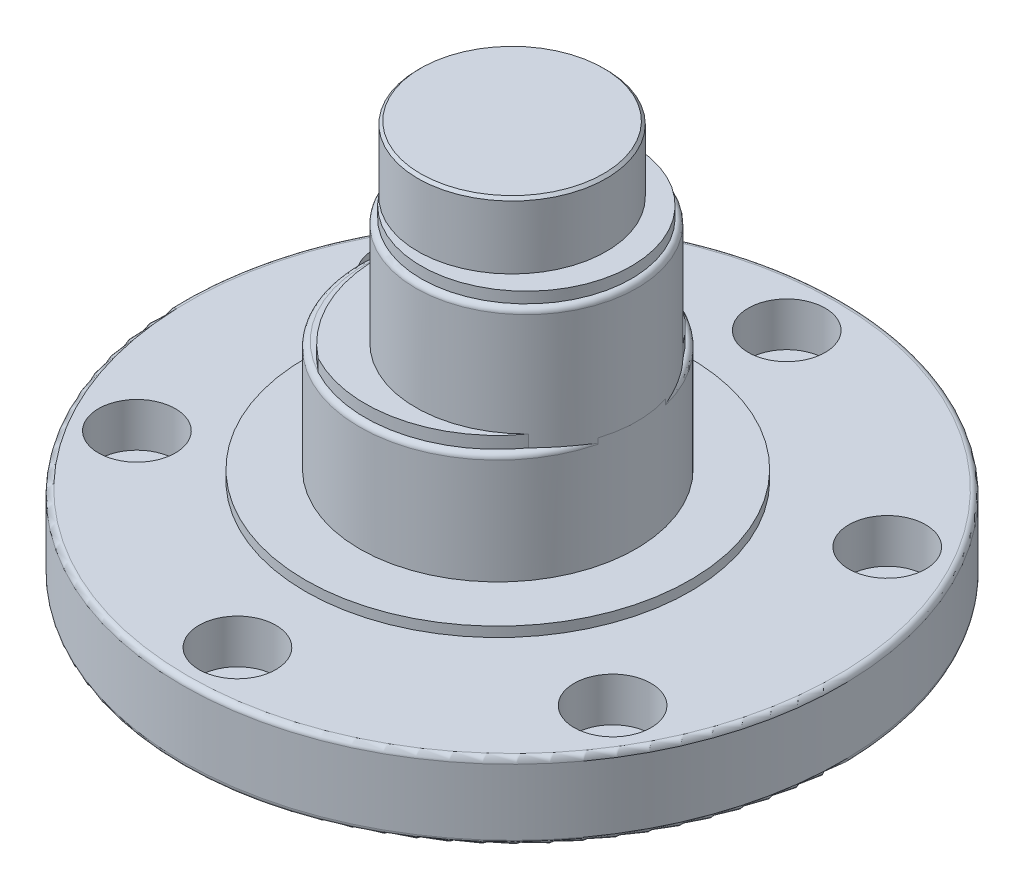
ISO-10303-21;
HEADER;
FILE_DESCRIPTION(('STEP AP214'),'2;1');
FILE_NAME('part.step','',(''),(''),'','','');
FILE_SCHEMA(('AUTOMOTIVE_DESIGN { 1 0 10303 214 1 1 1 1 }'));
ENDSEC;
DATA;
#1=APPLICATION_CONTEXT('core data for automotive mechanical design processes');
#2=APPLICATION_PROTOCOL_DEFINITION('international standard','automotive_design',2000,#1);
#3=PRODUCT_CONTEXT('',#1,'mechanical');
#4=PRODUCT('Part','Part','',(#3));
#5=PRODUCT_RELATED_PRODUCT_CATEGORY('part','',(#4));
#6=PRODUCT_DEFINITION_FORMATION('','',#4);
#7=PRODUCT_DEFINITION_CONTEXT('part definition',#1,'design');
#8=PRODUCT_DEFINITION('design','',#6,#7);
#9=PRODUCT_DEFINITION_SHAPE('','',#8);
#10=(LENGTH_UNIT() NAMED_UNIT(*) SI_UNIT(.MILLI.,.METRE.));
#11=(NAMED_UNIT(*) PLANE_ANGLE_UNIT() SI_UNIT($,.RADIAN.));
#12=(NAMED_UNIT(*) SI_UNIT($,.STERADIAN.) SOLID_ANGLE_UNIT());
#13=UNCERTAINTY_MEASURE_WITH_UNIT(LENGTH_MEASURE(1.E-05),#10,'distance_accuracy_value','');
#14=(GEOMETRIC_REPRESENTATION_CONTEXT(3) GLOBAL_UNCERTAINTY_ASSIGNED_CONTEXT((#13)) GLOBAL_UNIT_ASSIGNED_CONTEXT((#10,
#11,#12)) REPRESENTATION_CONTEXT('',''));
#15=CARTESIAN_POINT('',(0.,0.,0.));
#16=DIRECTION('',(0.,0.,1.));
#17=DIRECTION('',(1.,0.,0.));
#18=AXIS2_PLACEMENT_3D('',#15,#16,#17);
#19=CARTESIAN_POINT('',(0.,36.,0.));
#20=DIRECTION('',(0.,-1.,0.));
#21=DIRECTION('',(0.,0.,-1.));
#22=AXIS2_PLACEMENT_3D('',#19,#20,#21);
#23=CYLINDRICAL_SURFACE('',#22,8.575);
#24=CARTESIAN_POINT('',(0.,35.75,0.));
#25=DIRECTION('',(0.,1.,0.));
#26=DIRECTION('',(0.,0.,1.));
#27=AXIS2_PLACEMENT_3D('',#24,#25,#26);
#28=CIRCLE('',#27,8.575);
#29=CARTESIAN_POINT('',(0.,35.75,8.575));
#30=VERTEX_POINT('',#29);
#31=EDGE_CURVE('E11',#30,#30,#28,.F.);
#32=ORIENTED_EDGE('',*,*,#31,.T.);
#33=EDGE_LOOP('',(#32));
#34=FACE_BOUND('',#33,.T.);
#35=DIRECTION('',(0.,-1.,0.));
#36=VECTOR('',#35,1.);
#37=CARTESIAN_POINT('',(-6.33076923076923,30.,5.7837691816622));
#38=LINE('',#37,#36);
#39=CARTESIAN_POINT('',(-6.33076923076923,30.,5.7837691816622));
#40=VERTEX_POINT('',#39);
#41=CARTESIAN_POINT('',(-6.33076923076923,29.,5.7837691816622));
#42=VERTEX_POINT('',#41);
#43=EDGE_CURVE('E107',#40,#42,#38,.T.);
#44=ORIENTED_EDGE('',*,*,#43,.F.);
#45=CARTESIAN_POINT('',(0.,30.,0.));
#46=DIRECTION('',(0.,1.,0.));
#47=DIRECTION('',(0.,0.,1.));
#48=AXIS2_PLACEMENT_3D('',#45,#46,#47);
#49=CIRCLE('',#48,8.575);
#50=CARTESIAN_POINT('',(-6.33076923076924,30.,-5.7837691816622));
#51=VERTEX_POINT('',#50);
#52=EDGE_CURVE('E111',#51,#40,#49,.F.);
#53=ORIENTED_EDGE('',*,*,#52,.F.);
#54=DIRECTION('',(0.,-1.,0.));
#55=VECTOR('',#54,1.);
#56=CARTESIAN_POINT('',(-6.33076923076924,30.,-5.7837691816622));
#57=LINE('',#56,#55);
#58=CARTESIAN_POINT('',(-6.33076923076924,29.,-5.7837691816622));
#59=VERTEX_POINT('',#58);
#60=EDGE_CURVE('E55',#51,#59,#57,.T.);
#61=ORIENTED_EDGE('',*,*,#60,.T.);
#62=CARTESIAN_POINT('',(0.,29.,0.));
#63=DIRECTION('',(0.,1.,0.));
#64=DIRECTION('',(0.,0.,1.));
#65=AXIS2_PLACEMENT_3D('',#62,#63,#64);
#66=CIRCLE('',#65,8.575);
#67=EDGE_CURVE('E118',#59,#42,#66,.T.);
#68=ORIENTED_EDGE('',*,*,#67,.T.);
#69=EDGE_LOOP('',(#44,#53,#61,#68));
#70=FACE_BOUND('',#69,.T.);
#71=ADVANCED_FACE('F39',(#34,#70),#23,.T.);
#72=CARTESIAN_POINT('',(-1.3,18.,0.));
#73=DIRECTION('',(0.,1.,0.));
#74=DIRECTION('',(0.,0.,1.));
#75=AXIS2_PLACEMENT_3D('',#72,#73,#74);
#76=PLANE('',#75);
#77=CARTESIAN_POINT('',(-1.3,18.,0.));
#78=DIRECTION('',(0.,1.,0.));
#79=DIRECTION('',(0.,0.,1.));
#80=AXIS2_PLACEMENT_3D('',#77,#78,#79);
#81=CIRCLE('',#80,12.075);
#82=CARTESIAN_POINT('',(-7.00853365384615,18.,-10.6404073476022));
#83=VERTEX_POINT('',#82);
#84=CARTESIAN_POINT('',(-7.00853365384615,18.,10.6404073476022));
#85=VERTEX_POINT('',#84);
#86=EDGE_CURVE('E322',#83,#85,#81,.T.);
#87=ORIENTED_EDGE('',*,*,#86,.T.);
#88=CARTESIAN_POINT('',(1.3,18.,0.));
#89=DIRECTION('',(0.,1.,0.));
#90=DIRECTION('',(0.,0.,1.));
#91=AXIS2_PLACEMENT_3D('',#88,#89,#90);
#92=CIRCLE('',#91,13.5);
#93=EDGE_CURVE('E119',#83,#85,#92,.T.);
#94=ORIENTED_EDGE('',*,*,#93,.F.);
#95=EDGE_LOOP('',(#87,#94));
#96=FACE_BOUND('',#95,.T.);
#97=ADVANCED_FACE('F218',(#96),#76,.T.);
#98=CARTESIAN_POINT('',(1.3,29.,0.));
#99=DIRECTION('',(0.,-1.,0.));
#100=DIRECTION('',(0.,0.,-1.));
#101=AXIS2_PLACEMENT_3D('',#98,#99,#100);
#102=CYLINDRICAL_SURFACE('',#101,10.075);
#103=CARTESIAN_POINT('',(1.3,28.5,0.));
#104=DIRECTION('',(0.,1.,0.));
#105=DIRECTION('',(0.,0.,1.));
#106=AXIS2_PLACEMENT_3D('',#103,#104,#105);
#107=CIRCLE('',#106,10.075);
#108=CARTESIAN_POINT('',(1.3,28.5,10.075));
#109=VERTEX_POINT('',#108);
#110=EDGE_CURVE('E320',#109,#109,#107,.F.);
#111=ORIENTED_EDGE('',*,*,#110,.T.);
#112=EDGE_LOOP('',(#111));
#113=FACE_BOUND('',#112,.T.);
#114=DIRECTION('',(0.,-1.,0.));
#115=VECTOR('',#114,1.);
#116=CARTESIAN_POINT('',(8.51923076923076,19.1,-7.02768326695162));
#117=LINE('',#116,#115);
#118=CARTESIAN_POINT('',(8.51923076923076,19.1,-7.02768326695163));
#119=VERTEX_POINT('',#118);
#120=CARTESIAN_POINT('',(8.51923076923076,18.,-7.02768326695162));
#121=VERTEX_POINT('',#120);
#122=EDGE_CURVE('E133',#119,#121,#117,.T.);
#123=ORIENTED_EDGE('',*,*,#122,.F.);
#124=CARTESIAN_POINT('',(1.3,19.1,0.));
#125=DIRECTION('',(0.,1.,0.));
#126=DIRECTION('',(0.,0.,1.));
#127=AXIS2_PLACEMENT_3D('',#124,#125,#126);
#128=CIRCLE('',#127,10.075);
#129=CARTESIAN_POINT('',(8.51923076923076,19.1,7.02768326695163));
#130=VERTEX_POINT('',#129);
#131=EDGE_CURVE('E63',#130,#119,#128,.F.);
#132=ORIENTED_EDGE('',*,*,#131,.F.);
#133=DIRECTION('',(0.,-1.,0.));
#134=VECTOR('',#133,1.);
#135=CARTESIAN_POINT('',(8.51923076923076,19.1,7.02768326695162));
#136=LINE('',#135,#134);
#137=CARTESIAN_POINT('',(8.51923076923076,18.,7.02768326695162));
#138=VERTEX_POINT('',#137);
#139=EDGE_CURVE('E150',#130,#138,#136,.T.);
#140=ORIENTED_EDGE('',*,*,#139,.T.);
#141=CARTESIAN_POINT('',(8.51923076923076,18.,7.02768326695162));
#142=CARTESIAN_POINT('',(8.63563651238101,17.9999684024058,6.90811227600927));
#143=CARTESIAN_POINT('',(8.7490560153952,17.9981167499196,6.78565033873242));
#144=CARTESIAN_POINT('',(8.96979034874039,17.9911590841808,6.53512233379229));
#145=CARTESIAN_POINT('',(9.07709633859021,17.9860484822166,6.40704860171197));
#146=CARTESIAN_POINT('',(9.29103186201019,17.972590396752,6.13841764240633));
#147=CARTESIAN_POINT('',(9.39727898837566,17.9640760035583,5.99756419766097));
#148=CARTESIAN_POINT('',(9.60214213731524,17.94409120269,5.71061613671366));
#149=CARTESIAN_POINT('',(9.70075810874781,17.9326207752073,5.56452148539644));
#150=CARTESIAN_POINT('',(9.89004390439838,17.9068159390869,5.26761343610396));
#151=CARTESIAN_POINT('',(9.98071743631666,17.892482877149,5.11680228499382));
#152=CARTESIAN_POINT('',(10.1539030971911,17.8607869848689,4.81091561727283));
#153=CARTESIAN_POINT('',(10.2364169205342,17.8434247856144,4.65584099456786));
#154=CARTESIAN_POINT('',(10.3906459609302,17.8056559122197,4.3467993919537));
#155=CARTESIAN_POINT('',(10.4626162847149,17.7853600452634,4.19294657256156));
#156=CARTESIAN_POINT('',(10.576383637185,17.7469999795287,3.932864735744));
#157=CARTESIAN_POINT('',(10.6203899517399,17.730351049233,3.8273934451884));
#158=CARTESIAN_POINT('',(10.690834733771,17.6990706228465,3.65016990717206));
#159=CARTESIAN_POINT('',(10.7183210797934,17.6855527502076,3.57864195566854));
#160=CARTESIAN_POINT('',(10.7627824576873,17.660135955845,3.45890379524086));
#161=CARTESIAN_POINT('',(10.7802625654173,17.6491463413982,3.41069519730206));
#162=CARTESIAN_POINT('',(10.80875504528,17.6284022373743,3.33022335711136));
#163=CARTESIAN_POINT('',(10.8200260363025,17.6194035561468,3.29786065636582));
#164=CARTESIAN_POINT('',(10.8384974893218,17.602341589301,3.24395117869439));
#165=CARTESIAN_POINT('',(10.8458428896496,17.5949057753436,3.22226820517499));
#166=CARTESIAN_POINT('',(10.8578910938234,17.5806979027813,3.18631170667943));
#167=CARTESIAN_POINT('',(10.8626962309893,17.5744570831111,3.17185959394488));
#168=CARTESIAN_POINT('',(10.8716136409103,17.5609492811248,3.14483958533197));
#169=CARTESIAN_POINT('',(10.8757494118808,17.5538244220303,3.13221891276514));
#170=CARTESIAN_POINT('',(10.8805935385651,17.5427515969067,3.11734899485195));
#171=CARTESIAN_POINT('',(10.8816230668644,17.5402170261521,3.11418284936974));
#172=CARTESIAN_POINT('',(10.8835923956724,17.5348091063291,3.10811706908029));
#173=CARTESIAN_POINT('',(10.884532270936,17.5319360440517,3.10521721231163));
#174=CARTESIAN_POINT('',(10.8859610424923,17.5268210493493,3.10080301049841));
#175=CARTESIAN_POINT('',(10.8864932235483,17.5247062976434,3.09915717231018));
#176=CARTESIAN_POINT('',(10.8874619293133,17.5202552348708,3.0961591066495));
#177=CARTESIAN_POINT('',(10.8878986141614,17.5179193042791,3.09480638767603));
#178=CARTESIAN_POINT('',(10.8885335035987,17.5136788163291,3.09283866748171));
#179=CARTESIAN_POINT('',(10.8887642570633,17.5118265434161,3.09212311382008));
#180=CARTESIAN_POINT('',(10.8891287437987,17.5080256559023,3.09099260948892));
#181=CARTESIAN_POINT('',(10.8892627741906,17.5060773561552,3.09057673823829));
#182=CARTESIAN_POINT('',(10.8893958973663,17.5027453465986,3.09016363846877));
#183=CARTESIAN_POINT('',(10.8894238971405,17.5013733100571,3.09007673039277));
#184=CARTESIAN_POINT('',(10.8894230769231,17.5,3.09007929538634));
#185=B_SPLINE_CURVE_WITH_KNOTS('',3,(#141,#142,#143,#144,#145,#146,#147,#148,#149,#150,#151,
#152,#153,#154,#155,#156,#157,#158,#159,#160,#161,#162,#163,#164,#165,#166,#167,#168,#169,#170,
#171,#172,#173,#174,#175,#176,#177,#178,#179,#180,#181,#182,#183,#184),.UNSPECIFIED.,.F.,.F.,(4,
2,2,2,2,2,2,2,2,2,2,2,2,2,2,2,2,2,2,2,2,4),(0.,0.500548525736754,1.00180340169753,
1.53144331769353,2.06108678285924,2.59048166659905,3.11976638810272,3.63267625053849,
3.97903978052262,4.21241337535996,4.36969226421498,4.47595023304748,4.54808841108659,
4.59745820362851,4.64240269605959,4.65494131465977,4.66746938514627,4.67564800761874,
4.68381280823125,4.6897882827919,4.69574532238883,4.6998606502408),.UNSPECIFIED.);
#186=CARTESIAN_POINT('',(10.8894230769231,17.5,3.09007929538629));
#187=VERTEX_POINT('',#186);
#188=EDGE_CURVE('E161',#138,#187,#185,.T.);
#189=ORIENTED_EDGE('',*,*,#188,.T.);
#190=DIRECTION('',(0.,-1.,0.));
#191=VECTOR('',#190,1.);
#192=CARTESIAN_POINT('',(10.8894230769231,18.,3.09007929538632));
#193=LINE('',#192,#191);
#194=CARTESIAN_POINT('',(10.8894230769231,18.,3.09007929538632));
#195=VERTEX_POINT('',#194);
#196=EDGE_CURVE('E731',#195,#187,#193,.T.);
#197=ORIENTED_EDGE('',*,*,#196,.F.);
#198=CARTESIAN_POINT('',(1.3,18.,0.));
#199=DIRECTION('',(0.,1.,0.));
#200=DIRECTION('',(0.,0.,1.));
#201=AXIS2_PLACEMENT_3D('',#198,#199,#200);
#202=CIRCLE('',#201,10.075);
#203=CARTESIAN_POINT('',(10.8894230769231,18.,-3.09007929538632));
#204=VERTEX_POINT('',#203);
#205=EDGE_CURVE('E285',#195,#204,#202,.T.);
#206=ORIENTED_EDGE('',*,*,#205,.T.);
#207=DIRECTION('',(0.,-1.,0.));
#208=VECTOR('',#207,1.);
#209=CARTESIAN_POINT('',(10.8894230769231,17.5,-3.09007929538629));
#210=LINE('',#209,#208);
#211=CARTESIAN_POINT('',(10.8894230769231,17.5,-3.09007929538629));
#212=VERTEX_POINT('',#211);
#213=EDGE_CURVE('E325',#212,#204,#210,.F.);
#214=ORIENTED_EDGE('',*,*,#213,.F.);
#215=CARTESIAN_POINT('',(10.8894230769231,17.5,-3.09007929538629));
#216=CARTESIAN_POINT('',(10.8894249322048,17.5019818969448,-3.090073486734));
#217=CARTESIAN_POINT('',(10.8893661661757,17.5039552279584,-3.09025590896802));
#218=CARTESIAN_POINT('',(10.8891450859323,17.5078128286853,-3.09094188361186));
#219=CARTESIAN_POINT('',(10.8889841882797,17.5096979437811,-3.09144104285947));
#220=CARTESIAN_POINT('',(10.8885100858801,17.5139522106515,-3.09291125819031));
#221=CARTESIAN_POINT('',(10.888164557109,17.5162823085328,-3.09398239791877));
#222=CARTESIAN_POINT('',(10.8873646939747,17.5207467406168,-3.09646006943263));
#223=CARTESIAN_POINT('',(10.886909698842,17.5228797726828,-3.0978686378005));
#224=CARTESIAN_POINT('',(10.8855071911781,17.5286964497283,-3.10220654344998));
#225=CARTESIAN_POINT('',(10.884470510208,17.5321515615178,-3.10540855058277));
#226=CARTESIAN_POINT('',(10.8822627054832,17.5385796453053,-3.11221461600885));
#227=CARTESIAN_POINT('',(10.8810912394138,17.54155134127,-3.11581969730627));
#228=CARTESIAN_POINT('',(10.8746408877389,17.5566032907154,-3.13562704363359));
#229=CARTESIAN_POINT('',(10.8687305053312,17.5659005423062,-3.15362874526735));
#230=CARTESIAN_POINT('',(10.856541128296,17.5825445892521,-3.19038302673415));
#231=CARTESIAN_POINT('',(10.8502589151857,17.5898698826558,-3.2091415056035));
#232=CARTESIAN_POINT('',(10.831281832184,17.6098867471173,-3.26524293442823));
#233=CARTESIAN_POINT('',(10.818238295764,17.6209515756683,-3.30308425408914));
#234=CARTESIAN_POINT('',(10.7915378956933,17.6412288183542,-3.37904932933146));
#235=CARTESIAN_POINT('',(10.7778798204124,17.6504373575931,-3.41717350694374));
#236=CARTESIAN_POINT('',(10.7500817230538,17.6676135384842,-3.49330924770546));
#237=CARTESIAN_POINT('',(10.7359445265466,17.6755872920705,-3.53132038805432));
#238=CARTESIAN_POINT('',(10.7071729367483,17.6907328924427,-3.6072666052646));
#239=CARTESIAN_POINT('',(10.6925389966074,17.6979054457757,-3.64520171970496));
#240=CARTESIAN_POINT('',(10.6478203967216,17.718580860385,-3.7590604928131));
#241=CARTESIAN_POINT('',(10.6169865251882,17.7312023140341,-3.8348523867442));
#242=CARTESIAN_POINT('',(10.5533907674832,17.754944636576,-3.98586287527502));
#243=CARTESIAN_POINT('',(10.5206285971193,17.7660652834807,-4.06108138351482));
#244=CARTESIAN_POINT('',(10.419456748577,17.7977867125493,-4.28580531598572));
#245=CARTESIAN_POINT('',(10.3482021019947,17.8167297456464,-4.43427627038655));
#246=CARTESIAN_POINT('',(10.1981539747245,17.8515981548566,-4.72819085443502));
#247=CARTESIAN_POINT('',(10.1193415474002,17.8675156320315,-4.87362570077574));
#248=CARTESIAN_POINT('',(9.95454983162089,17.8966848877794,-5.16059674433968));
#249=CARTESIAN_POINT('',(9.86857265936578,17.9099374495503,-5.30213407642688));
#250=CARTESIAN_POINT('',(9.68778288056637,17.9341519918792,-5.58384399875347));
#251=CARTESIAN_POINT('',(9.59282389717455,17.9450607043854,-5.72392724726317));
#252=CARTESIAN_POINT('',(9.39586738897762,17.9641498943367,-5.99926762136445));
#253=CARTESIAN_POINT('',(9.29386923462786,17.9723301273789,-6.13452431365008));
#254=CARTESIAN_POINT('',(9.08346427119882,17.9857241858266,-6.39935967503724));
#255=CARTESIAN_POINT('',(8.97508054595442,17.9909480496999,-6.52895616305074));
#256=CARTESIAN_POINT('',(8.75189492548083,17.9980693432411,-6.78258443465405));
#257=CARTESIAN_POINT('',(8.63709326870626,17.9999668964115,-6.90661642468142));
#258=CARTESIAN_POINT('',(8.51923076923076,18.0000000000001,-7.02768326695162));
#259=B_SPLINE_CURVE_WITH_KNOTS('',3,(#215,#216,#217,#218,#219,#220,#221,#222,#223,#224,#225,
#226,#227,#228,#229,#230,#231,#232,#233,#234,#235,#236,#237,#238,#239,#240,#241,#242,#243,#244,
#245,#246,#247,#248,#249,#250,#251,#252,#253,#254,#255,#256,#257,#258),.UNSPECIFIED.,.F.,.F.,(4,
2,2,2,2,2,2,2,2,2,2,2,2,2,2,2,2,2,2,2,2,4),(0.,0.00592265204308466,0.011764900394135,
0.019484001984245,0.0272509218968861,0.0416400207240461,0.056066505696541,0.118750582416991,
0.182092758361116,0.306442272822812,0.431048731323069,0.55501721185437,0.678875491668798,
0.927194629182872,1.17555045602106,1.67259718794041,2.17092427270571,2.6691046883057,
3.17762803580076,3.68619692190688,4.19302841873294,4.69984109702012),.UNSPECIFIED.);
#260=EDGE_CURVE('E158',#212,#121,#259,.T.);
#261=ORIENTED_EDGE('',*,*,#260,.T.);
#262=EDGE_LOOP('',(#123,#132,#140,#189,#197,#206,#214,#261));
#263=FACE_BOUND('',#262,.T.);
#264=ADVANCED_FACE('F181',(#113,#263),#102,.T.);
#265=CARTESIAN_POINT('',(-1.3,18.,0.));
#266=DIRECTION('',(0.,-1.,0.));
#267=DIRECTION('',(0.,0.,-1.));
#268=AXIS2_PLACEMENT_3D('',#265,#266,#267);
#269=CYLINDRICAL_SURFACE('',#268,12.575);
#270=CARTESIAN_POINT('',(-1.3,7.9,0.));
#271=DIRECTION('',(0.,1.,0.));
#272=DIRECTION('',(0.,0.,1.));
#273=AXIS2_PLACEMENT_3D('',#270,#271,#272);
#274=CIRCLE('',#273,12.575);
#275=CARTESIAN_POINT('',(-1.3,7.9,12.575));
#276=VERTEX_POINT('',#275);
#277=EDGE_CURVE('E155',#276,#276,#274,.T.);
#278=ORIENTED_EDGE('',*,*,#277,.T.);
#279=EDGE_LOOP('',(#278));
#280=FACE_BOUND('',#279,.T.);
#281=CARTESIAN_POINT('',(-1.3,18.,0.));
#282=DIRECTION('',(0.,1.,0.));
#283=DIRECTION('',(0.,0.,1.));
#284=AXIS2_PLACEMENT_3D('',#281,#282,#283);
#285=CIRCLE('',#284,12.575);
#286=EDGE_CURVE('E287',#195,#204,#285,.T.);
#287=ORIENTED_EDGE('',*,*,#286,.F.);
#288=ORIENTED_EDGE('',*,*,#196,.T.);
#289=CARTESIAN_POINT('',(-1.3,17.5,0.));
#290=DIRECTION('',(0.,1.,0.));
#291=DIRECTION('',(0.,0.,1.));
#292=AXIS2_PLACEMENT_3D('',#289,#290,#291);
#293=CIRCLE('',#292,12.575);
#294=EDGE_CURVE('E736',#187,#212,#293,.F.);
#295=ORIENTED_EDGE('',*,*,#294,.T.);
#296=ORIENTED_EDGE('',*,*,#213,.T.);
#297=EDGE_LOOP('',(#287,#288,#295,#296));
#298=FACE_BOUND('',#297,.T.);
#299=ADVANCED_FACE('F273',(#280,#298),#269,.T.);
#300=CARTESIAN_POINT('',(1.3,18.,0.));
#301=DIRECTION('',(0.,1.,0.));
#302=DIRECTION('',(0.,0.,1.));
#303=AXIS2_PLACEMENT_3D('',#300,#301,#302);
#304=PLANE('',#303);
#305=ORIENTED_EDGE('',*,*,#205,.F.);
#306=ORIENTED_EDGE('',*,*,#286,.T.);
#307=EDGE_LOOP('',(#305,#306));
#308=FACE_BOUND('',#307,.T.);
#309=ADVANCED_FACE('F271',(#308),#304,.F.);
#310=CARTESIAN_POINT('',(1.3,28.5,0.));
#311=DIRECTION('',(0.,1.,0.));
#312=DIRECTION('',(0.,0.,1.));
#313=AXIS2_PLACEMENT_3D('',#310,#311,#312);
#314=TOROIDAL_SURFACE('',#313,9.575,0.5);
#315=ORIENTED_EDGE('',*,*,#110,.F.);
#316=EDGE_LOOP('',(#315));
#317=FACE_BOUND('',#316,.T.);
#318=CARTESIAN_POINT('',(1.3,29.,0.));
#319=DIRECTION('',(0.,1.,0.));
#320=DIRECTION('',(0.,0.,1.));
#321=AXIS2_PLACEMENT_3D('',#318,#319,#320);
#322=CIRCLE('',#321,9.575);
#323=EDGE_CURVE('E317',#59,#42,#322,.T.);
#324=ORIENTED_EDGE('',*,*,#323,.F.);
#325=EDGE_CURVE('E316',#42,#59,#322,.T.);
#326=ORIENTED_EDGE('',*,*,#325,.F.);
#327=EDGE_LOOP('',(#324,#326));
#328=FACE_BOUND('',#327,.T.);
#329=ADVANCED_FACE('F191',(#317,#328),#314,.T.);
#330=CARTESIAN_POINT('',(-1.3,17.5,0.));
#331=DIRECTION('',(0.,1.,0.));
#332=DIRECTION('',(0.,0.,1.));
#333=AXIS2_PLACEMENT_3D('',#330,#331,#332);
#334=TOROIDAL_SURFACE('',#333,12.075,0.5);
#335=ORIENTED_EDGE('',*,*,#260,.F.);
#336=ORIENTED_EDGE('',*,*,#294,.F.);
#337=ORIENTED_EDGE('',*,*,#188,.F.);
#338=CARTESIAN_POINT('',(-1.3,18.,0.));
#339=DIRECTION('',(0.,1.,0.));
#340=DIRECTION('',(0.,0.,1.));
#341=AXIS2_PLACEMENT_3D('',#338,#339,#340);
#342=CIRCLE('',#341,12.075);
#343=EDGE_CURVE('E122',#85,#138,#342,.T.);
#344=ORIENTED_EDGE('',*,*,#343,.F.);
#345=ORIENTED_EDGE('',*,*,#86,.F.);
#346=EDGE_CURVE('E140',#121,#83,#81,.T.);
#347=ORIENTED_EDGE('',*,*,#346,.F.);
#348=EDGE_LOOP('',(#335,#336,#337,#344,#345,#347));
#349=FACE_BOUND('',#348,.T.);
#350=ADVANCED_FACE('F185',(#349),#334,.T.);
#351=CARTESIAN_POINT('',(0.,36.,0.));
#352=DIRECTION('',(0.,1.,0.));
#353=DIRECTION('',(0.,0.,1.));
#354=AXIS2_PLACEMENT_3D('',#351,#352,#353);
#355=PLANE('',#354);
#356=CARTESIAN_POINT('',(0.,36.,0.));
#357=DIRECTION('',(0.,1.,0.));
#358=DIRECTION('',(0.,0.,1.));
#359=AXIS2_PLACEMENT_3D('',#356,#357,#358);
#360=CIRCLE('',#359,8.325);
#361=CARTESIAN_POINT('',(0.,36.,8.325));
#362=VERTEX_POINT('',#361);
#363=EDGE_CURVE('E48',#362,#362,#360,.T.);
#364=ORIENTED_EDGE('',*,*,#363,.T.);
#365=EDGE_LOOP('',(#364));
#366=FACE_BOUND('',#365,.T.);
#367=ADVANCED_FACE('F190',(#366),#355,.T.);
#368=CARTESIAN_POINT('',(0.,29.,0.));
#369=DIRECTION('',(0.,1.,0.));
#370=DIRECTION('',(0.,0.,1.));
#371=AXIS2_PLACEMENT_3D('',#368,#369,#370);
#372=PLANE('',#371);
#373=ORIENTED_EDGE('',*,*,#323,.T.);
#374=ORIENTED_EDGE('',*,*,#67,.F.);
#375=EDGE_LOOP('',(#373,#374));
#376=FACE_BOUND('',#375,.T.);
#377=ADVANCED_FACE('F227',(#376),#372,.F.);
#378=CARTESIAN_POINT('',(-1.3,7.9,0.));
#379=DIRECTION('',(0.,1.,0.));
#380=DIRECTION('',(0.,0.,1.));
#381=AXIS2_PLACEMENT_3D('',#378,#379,#380);
#382=PLANE('',#381);
#383=CARTESIAN_POINT('',(-1.3,7.9,0.));
#384=DIRECTION('',(0.,1.,0.));
#385=DIRECTION('',(0.,0.,1.));
#386=AXIS2_PLACEMENT_3D('',#383,#384,#385);
#387=CIRCLE('',#386,17.5);
#388=CARTESIAN_POINT('',(-1.3,7.9,17.5));
#389=VERTEX_POINT('',#388);
#390=EDGE_CURVE('E395',#389,#389,#387,.T.);
#391=ORIENTED_EDGE('',*,*,#390,.T.);
#392=EDGE_LOOP('',(#391));
#393=FACE_BOUND('',#392,.T.);
#394=ORIENTED_EDGE('',*,*,#277,.F.);
#395=EDGE_LOOP('',(#394));
#396=FACE_BOUND('',#395,.T.);
#397=ADVANCED_FACE('F425',(#393,#396),#382,.T.);
#398=CARTESIAN_POINT('',(-1.3,7.9,0.));
#399=DIRECTION('',(0.,-1.,0.));
#400=DIRECTION('',(0.,0.,-1.));
#401=AXIS2_PLACEMENT_3D('',#398,#399,#400);
#402=CYLINDRICAL_SURFACE('',#401,17.5);
#403=ORIENTED_EDGE('',*,*,#390,.F.);
#404=EDGE_LOOP('',(#403));
#405=FACE_BOUND('',#404,.T.);
#406=CARTESIAN_POINT('',(-1.3,7.,0.));
#407=DIRECTION('',(0.,1.,0.));
#408=DIRECTION('',(0.,0.,1.));
#409=AXIS2_PLACEMENT_3D('',#406,#407,#408);
#410=CIRCLE('',#409,17.5);
#411=CARTESIAN_POINT('',(-1.3,7.,17.5));
#412=VERTEX_POINT('',#411);
#413=EDGE_CURVE('E393',#412,#412,#410,.T.);
#414=ORIENTED_EDGE('',*,*,#413,.T.);
#415=EDGE_LOOP('',(#414));
#416=FACE_BOUND('',#415,.T.);
#417=ADVANCED_FACE('F428',(#405,#416),#402,.T.);
#418=CARTESIAN_POINT('',(0.,0.,0.));
#419=DIRECTION('',(0.,1.,0.));
#420=DIRECTION('',(0.,0.,1.));
#421=AXIS2_PLACEMENT_3D('',#418,#419,#420);
#422=PLANE('',#421);
#423=CARTESIAN_POINT('',(0.,0.,0.));
#424=DIRECTION('',(0.,1.,0.));
#425=DIRECTION('',(0.,0.,1.));
#426=AXIS2_PLACEMENT_3D('',#423,#424,#425);
#427=CIRCLE('',#426,29.5);
#428=CARTESIAN_POINT('',(0.,0.,29.5));
#429=VERTEX_POINT('',#428);
#430=EDGE_CURVE('E733',#429,#429,#427,.F.);
#431=ORIENTED_EDGE('',*,*,#430,.T.);
#432=EDGE_LOOP('',(#431));
#433=FACE_BOUND('',#432,.T.);
#434=CARTESIAN_POINT('',(0.,0.,-25.));
#435=DIRECTION('',(0.,1.,0.));
#436=DIRECTION('',(0.,0.,1.));
#437=AXIS2_PLACEMENT_3D('',#434,#435,#436);
#438=CIRCLE('',#437,2.05);
#439=CARTESIAN_POINT('',(0.,0.,-22.95));
#440=VERTEX_POINT('',#439);
#441=EDGE_CURVE('E313',#440,#440,#438,.T.);
#442=ORIENTED_EDGE('',*,*,#441,.T.);
#443=EDGE_LOOP('',(#442));
#444=FACE_BOUND('',#443,.T.);
#445=CARTESIAN_POINT('',(21.6506350946115,0.,-12.5000000000009));
#446=DIRECTION('',(0.,1.,0.));
#447=DIRECTION('',(0.,0.,1.));
#448=AXIS2_PLACEMENT_3D('',#445,#446,#447);
#449=CIRCLE('',#448,2.05);
#450=CARTESIAN_POINT('',(21.6506350946115,0.,-10.4500000000009));
#451=VERTEX_POINT('',#450);
#452=EDGE_CURVE('E310',#451,#451,#449,.T.);
#453=ORIENTED_EDGE('',*,*,#452,.T.);
#454=EDGE_LOOP('',(#453));
#455=FACE_BOUND('',#454,.T.);
#456=CARTESIAN_POINT('',(21.6506350946126,0.,12.4999999999991));
#457=DIRECTION('',(0.,1.,0.));
#458=DIRECTION('',(0.,0.,1.));
#459=AXIS2_PLACEMENT_3D('',#456,#457,#458);
#460=CIRCLE('',#459,2.05);
#461=CARTESIAN_POINT('',(21.6506350946126,0.,14.5499999999991));
#462=VERTEX_POINT('',#461);
#463=EDGE_CURVE('E307',#462,#462,#460,.T.);
#464=ORIENTED_EDGE('',*,*,#463,.T.);
#465=EDGE_LOOP('',(#464));
#466=FACE_BOUND('',#465,.T.);
#467=CARTESIAN_POINT('',(2.1224433562867E-12,0.,25.));
#468=DIRECTION('',(0.,1.,0.));
#469=DIRECTION('',(0.,0.,1.));
#470=AXIS2_PLACEMENT_3D('',#467,#468,#469);
#471=CIRCLE('',#470,2.05);
#472=CARTESIAN_POINT('',(2.1224433562867E-12,0.,27.05));
#473=VERTEX_POINT('',#472);
#474=EDGE_CURVE('E304',#473,#473,#471,.T.);
#475=ORIENTED_EDGE('',*,*,#474,.T.);
#476=EDGE_LOOP('',(#475));
#477=FACE_BOUND('',#476,.T.);
#478=CARTESIAN_POINT('',(-21.6506350946094,0.,12.5000000000009));
#479=DIRECTION('',(0.,1.,0.));
#480=DIRECTION('',(0.,0.,1.));
#481=AXIS2_PLACEMENT_3D('',#478,#479,#480);
#482=CIRCLE('',#481,2.05);
#483=CARTESIAN_POINT('',(-21.6506350946094,0.,14.5500000000009));
#484=VERTEX_POINT('',#483);
#485=EDGE_CURVE('E301',#484,#484,#482,.T.);
#486=ORIENTED_EDGE('',*,*,#485,.T.);
#487=EDGE_LOOP('',(#486));
#488=FACE_BOUND('',#487,.T.);
#489=CARTESIAN_POINT('',(-21.6506350946104,0.,-12.4999999999991));
#490=DIRECTION('',(0.,1.,0.));
#491=DIRECTION('',(0.,0.,1.));
#492=AXIS2_PLACEMENT_3D('',#489,#490,#491);
#493=CIRCLE('',#492,2.05);
#494=CARTESIAN_POINT('',(-21.6506350946104,0.,-10.4499999999991));
#495=VERTEX_POINT('',#494);
#496=EDGE_CURVE('E290',#495,#495,#493,.T.);
#497=ORIENTED_EDGE('',*,*,#496,.T.);
#498=EDGE_LOOP('',(#497));
#499=FACE_BOUND('',#498,.T.);
#500=ADVANCED_FACE('F431',(#433,#444,#455,#466,#477,#488,#499),#422,.F.);
#501=CARTESIAN_POINT('',(0.,7.,-25.));
#502=DIRECTION('',(0.,-1.,0.));
#503=DIRECTION('',(0.,0.,-1.));
#504=AXIS2_PLACEMENT_3D('',#501,#502,#503);
#505=CYLINDRICAL_SURFACE('',#504,2.05);
#506=ORIENTED_EDGE('',*,*,#441,.F.);
#507=EDGE_LOOP('',(#506));
#508=FACE_BOUND('',#507,.T.);
#509=CARTESIAN_POINT('',(0.,3.,-25.));
#510=DIRECTION('',(0.,1.,0.));
#511=DIRECTION('',(0.,0.,1.));
#512=AXIS2_PLACEMENT_3D('',#509,#510,#511);
#513=CIRCLE('',#512,2.05);
#514=CARTESIAN_POINT('',(0.,3.,-22.95));
#515=VERTEX_POINT('',#514);
#516=EDGE_CURVE('E288',#515,#515,#513,.T.);
#517=ORIENTED_EDGE('',*,*,#516,.T.);
#518=EDGE_LOOP('',(#517));
#519=FACE_BOUND('',#518,.T.);
#520=ADVANCED_FACE('F460',(#508,#519),#505,.F.);
#521=CARTESIAN_POINT('',(-21.6506350946104,7.,-12.4999999999991));
#522=DIRECTION('',(0.,-1.,0.));
#523=DIRECTION('',(0.,0.,-1.));
#524=AXIS2_PLACEMENT_3D('',#521,#522,#523);
#525=CYLINDRICAL_SURFACE('',#524,2.05);
#526=ORIENTED_EDGE('',*,*,#496,.F.);
#527=EDGE_LOOP('',(#526));
#528=FACE_BOUND('',#527,.T.);
#529=CARTESIAN_POINT('',(-21.6506350946104,3.,-12.4999999999991));
#530=DIRECTION('',(0.,1.,0.));
#531=DIRECTION('',(0.,0.,1.));
#532=AXIS2_PLACEMENT_3D('',#529,#530,#531);
#533=CIRCLE('',#532,2.05);
#534=CARTESIAN_POINT('',(-21.6506350946104,3.,-10.4499999999991));
#535=VERTEX_POINT('',#534);
#536=EDGE_CURVE('E179',#535,#535,#533,.T.);
#537=ORIENTED_EDGE('',*,*,#536,.T.);
#538=EDGE_LOOP('',(#537));
#539=FACE_BOUND('',#538,.T.);
#540=ADVANCED_FACE('F469',(#528,#539),#525,.F.);
#541=CARTESIAN_POINT('',(-21.6506350946094,7.,12.5000000000009));
#542=DIRECTION('',(0.,-1.,0.));
#543=DIRECTION('',(0.,0.,-1.));
#544=AXIS2_PLACEMENT_3D('',#541,#542,#543);
#545=CYLINDRICAL_SURFACE('',#544,2.05);
#546=ORIENTED_EDGE('',*,*,#485,.F.);
#547=EDGE_LOOP('',(#546));
#548=FACE_BOUND('',#547,.T.);
#549=CARTESIAN_POINT('',(-21.6506350946094,3.,12.5000000000009));
#550=DIRECTION('',(0.,1.,0.));
#551=DIRECTION('',(0.,0.,1.));
#552=AXIS2_PLACEMENT_3D('',#549,#550,#551);
#553=CIRCLE('',#552,2.05);
#554=CARTESIAN_POINT('',(-21.6506350946094,3.,14.5500000000009));
#555=VERTEX_POINT('',#554);
#556=EDGE_CURVE('E337',#555,#555,#553,.T.);
#557=ORIENTED_EDGE('',*,*,#556,.T.);
#558=EDGE_LOOP('',(#557));
#559=FACE_BOUND('',#558,.T.);
#560=ADVANCED_FACE('F478',(#548,#559),#545,.F.);
#561=CARTESIAN_POINT('',(2.1224433562867E-12,7.,25.));
#562=DIRECTION('',(0.,-1.,0.));
#563=DIRECTION('',(0.,0.,-1.));
#564=AXIS2_PLACEMENT_3D('',#561,#562,#563);
#565=CYLINDRICAL_SURFACE('',#564,2.05);
#566=ORIENTED_EDGE('',*,*,#474,.F.);
#567=EDGE_LOOP('',(#566));
#568=FACE_BOUND('',#567,.T.);
#569=CARTESIAN_POINT('',(2.1224433562867E-12,3.,25.));
#570=DIRECTION('',(0.,1.,0.));
#571=DIRECTION('',(0.,0.,1.));
#572=AXIS2_PLACEMENT_3D('',#569,#570,#571);
#573=CIRCLE('',#572,2.05);
#574=CARTESIAN_POINT('',(2.1224433562867E-12,3.,27.05));
#575=VERTEX_POINT('',#574);
#576=EDGE_CURVE('E335',#575,#575,#573,.T.);
#577=ORIENTED_EDGE('',*,*,#576,.T.);
#578=EDGE_LOOP('',(#577));
#579=FACE_BOUND('',#578,.T.);
#580=ADVANCED_FACE('F487',(#568,#579),#565,.F.);
#581=CARTESIAN_POINT('',(21.6506350946126,7.,12.4999999999991));
#582=DIRECTION('',(0.,-1.,0.));
#583=DIRECTION('',(0.,0.,-1.));
#584=AXIS2_PLACEMENT_3D('',#581,#582,#583);
#585=CYLINDRICAL_SURFACE('',#584,2.05);
#586=ORIENTED_EDGE('',*,*,#463,.F.);
#587=EDGE_LOOP('',(#586));
#588=FACE_BOUND('',#587,.T.);
#589=CARTESIAN_POINT('',(21.6506350946126,3.,12.4999999999991));
#590=DIRECTION('',(0.,1.,0.));
#591=DIRECTION('',(0.,0.,1.));
#592=AXIS2_PLACEMENT_3D('',#589,#590,#591);
#593=CIRCLE('',#592,2.05);
#594=CARTESIAN_POINT('',(21.6506350946126,3.,14.5499999999991));
#595=VERTEX_POINT('',#594);
#596=EDGE_CURVE('E332',#595,#595,#593,.T.);
#597=ORIENTED_EDGE('',*,*,#596,.T.);
#598=EDGE_LOOP('',(#597));
#599=FACE_BOUND('',#598,.T.);
#600=ADVANCED_FACE('F495',(#588,#599),#585,.F.);
#601=CARTESIAN_POINT('',(21.6506350946115,7.,-12.5000000000009));
#602=DIRECTION('',(0.,-1.,0.));
#603=DIRECTION('',(0.,0.,-1.));
#604=AXIS2_PLACEMENT_3D('',#601,#602,#603);
#605=CYLINDRICAL_SURFACE('',#604,2.05);
#606=ORIENTED_EDGE('',*,*,#452,.F.);
#607=EDGE_LOOP('',(#606));
#608=FACE_BOUND('',#607,.T.);
#609=CARTESIAN_POINT('',(21.6506350946115,3.,-12.5000000000009));
#610=DIRECTION('',(0.,1.,0.));
#611=DIRECTION('',(0.,0.,1.));
#612=AXIS2_PLACEMENT_3D('',#609,#610,#611);
#613=CIRCLE('',#612,2.05);
#614=CARTESIAN_POINT('',(21.6506350946115,3.,-10.4500000000009));
#615=VERTEX_POINT('',#614);
#616=EDGE_CURVE('E293',#615,#615,#613,.T.);
#617=ORIENTED_EDGE('',*,*,#616,.T.);
#618=EDGE_LOOP('',(#617));
#619=FACE_BOUND('',#618,.T.);
#620=ADVANCED_FACE('F198',(#608,#619),#605,.F.);
#621=CARTESIAN_POINT('',(0.,0.5,0.));
#622=DIRECTION('',(0.,1.,0.));
#623=DIRECTION('',(0.,0.,1.));
#624=AXIS2_PLACEMENT_3D('',#621,#622,#623);
#625=TOROIDAL_SURFACE('',#624,29.5,0.5);
#626=ORIENTED_EDGE('',*,*,#430,.F.);
#627=EDGE_LOOP('',(#626));
#628=FACE_BOUND('',#627,.T.);
#629=CARTESIAN_POINT('',(0.,0.5,0.));
#630=DIRECTION('',(0.,1.,0.));
#631=DIRECTION('',(0.,0.,1.));
#632=AXIS2_PLACEMENT_3D('',#629,#630,#631);
#633=CIRCLE('',#632,30.);
#634=CARTESIAN_POINT('',(0.,0.5,30.));
#635=VERTEX_POINT('',#634);
#636=EDGE_CURVE('E728',#635,#635,#633,.T.);
#637=ORIENTED_EDGE('',*,*,#636,.F.);
#638=EDGE_LOOP('',(#637));
#639=FACE_BOUND('',#638,.T.);
#640=ADVANCED_FACE('F194',(#628,#639),#625,.T.);
#641=CARTESIAN_POINT('',(0.,3.,-25.));
#642=DIRECTION('',(0.,1.,0.));
#643=DIRECTION('',(0.,0.,1.));
#644=AXIS2_PLACEMENT_3D('',#641,#642,#643);
#645=PLANE('',#644);
#646=ORIENTED_EDGE('',*,*,#516,.F.);
#647=EDGE_LOOP('',(#646));
#648=FACE_BOUND('',#647,.T.);
#649=CARTESIAN_POINT('',(0.,3.,-25.));
#650=DIRECTION('',(0.,1.,0.));
#651=DIRECTION('',(0.,0.,1.));
#652=AXIS2_PLACEMENT_3D('',#649,#650,#651);
#653=CIRCLE('',#652,3.5);
#654=CARTESIAN_POINT('',(0.,3.,-21.5));
#655=VERTEX_POINT('',#654);
#656=EDGE_CURVE('E342',#655,#655,#653,.T.);
#657=ORIENTED_EDGE('',*,*,#656,.T.);
#658=EDGE_LOOP('',(#657));
#659=FACE_BOUND('',#658,.T.);
#660=ADVANCED_FACE('F197',(#648,#659),#645,.T.);
#661=CARTESIAN_POINT('',(-21.6506350946104,3.,-12.4999999999991));
#662=DIRECTION('',(0.,1.,0.));
#663=DIRECTION('',(0.,0.,1.));
#664=AXIS2_PLACEMENT_3D('',#661,#662,#663);
#665=PLANE('',#664);
#666=ORIENTED_EDGE('',*,*,#536,.F.);
#667=EDGE_LOOP('',(#666));
#668=FACE_BOUND('',#667,.T.);
#669=CARTESIAN_POINT('',(-21.6506350946104,3.,-12.4999999999991));
#670=DIRECTION('',(0.,1.,0.));
#671=DIRECTION('',(0.,0.,1.));
#672=AXIS2_PLACEMENT_3D('',#669,#670,#671);
#673=CIRCLE('',#672,3.5);
#674=CARTESIAN_POINT('',(-21.6506350946104,3.,-8.99999999999906));
#675=VERTEX_POINT('',#674);
#676=EDGE_CURVE('E356',#675,#675,#673,.T.);
#677=ORIENTED_EDGE('',*,*,#676,.T.);
#678=EDGE_LOOP('',(#677));
#679=FACE_BOUND('',#678,.T.);
#680=ADVANCED_FACE('F231',(#668,#679),#665,.T.);
#681=CARTESIAN_POINT('',(-21.6506350946094,3.,12.5000000000009));
#682=DIRECTION('',(0.,1.,0.));
#683=DIRECTION('',(0.,0.,1.));
#684=AXIS2_PLACEMENT_3D('',#681,#682,#683);
#685=PLANE('',#684);
#686=ORIENTED_EDGE('',*,*,#556,.F.);
#687=EDGE_LOOP('',(#686));
#688=FACE_BOUND('',#687,.T.);
#689=CARTESIAN_POINT('',(-21.6506350946094,3.,12.5000000000009));
#690=DIRECTION('',(0.,1.,0.));
#691=DIRECTION('',(0.,0.,1.));
#692=AXIS2_PLACEMENT_3D('',#689,#690,#691);
#693=CIRCLE('',#692,3.5);
#694=CARTESIAN_POINT('',(-21.6506350946094,3.,16.0000000000009));
#695=VERTEX_POINT('',#694);
#696=EDGE_CURVE('E378',#695,#695,#693,.T.);
#697=ORIENTED_EDGE('',*,*,#696,.T.);
#698=EDGE_LOOP('',(#697));
#699=FACE_BOUND('',#698,.T.);
#700=ADVANCED_FACE('F241',(#688,#699),#685,.T.);
#701=CARTESIAN_POINT('',(2.1224433562867E-12,3.,25.));
#702=DIRECTION('',(0.,1.,0.));
#703=DIRECTION('',(0.,0.,1.));
#704=AXIS2_PLACEMENT_3D('',#701,#702,#703);
#705=PLANE('',#704);
#706=ORIENTED_EDGE('',*,*,#576,.F.);
#707=EDGE_LOOP('',(#706));
#708=FACE_BOUND('',#707,.T.);
#709=CARTESIAN_POINT('',(2.1224433562867E-12,3.,25.));
#710=DIRECTION('',(0.,1.,0.));
#711=DIRECTION('',(0.,0.,1.));
#712=AXIS2_PLACEMENT_3D('',#709,#710,#711);
#713=CIRCLE('',#712,3.5);
#714=CARTESIAN_POINT('',(2.1224433562867E-12,3.,28.5));
#715=VERTEX_POINT('',#714);
#716=EDGE_CURVE('E373',#715,#715,#713,.T.);
#717=ORIENTED_EDGE('',*,*,#716,.T.);
#718=EDGE_LOOP('',(#717));
#719=FACE_BOUND('',#718,.T.);
#720=ADVANCED_FACE('F254',(#708,#719),#705,.T.);
#721=CARTESIAN_POINT('',(21.6506350946126,3.,12.4999999999991));
#722=DIRECTION('',(0.,1.,0.));
#723=DIRECTION('',(0.,0.,1.));
#724=AXIS2_PLACEMENT_3D('',#721,#722,#723);
#725=PLANE('',#724);
#726=ORIENTED_EDGE('',*,*,#596,.F.);
#727=EDGE_LOOP('',(#726));
#728=FACE_BOUND('',#727,.T.);
#729=CARTESIAN_POINT('',(21.6506350946126,3.,12.4999999999991));
#730=DIRECTION('',(0.,1.,0.));
#731=DIRECTION('',(0.,0.,1.));
#732=AXIS2_PLACEMENT_3D('',#729,#730,#731);
#733=CIRCLE('',#732,3.5);
#734=CARTESIAN_POINT('',(21.6506350946126,3.,15.9999999999991));
#735=VERTEX_POINT('',#734);
#736=EDGE_CURVE('E367',#735,#735,#733,.T.);
#737=ORIENTED_EDGE('',*,*,#736,.T.);
#738=EDGE_LOOP('',(#737));
#739=FACE_BOUND('',#738,.T.);
#740=ADVANCED_FACE('F249',(#728,#739),#725,.T.);
#741=CARTESIAN_POINT('',(21.6506350946115,3.,-12.5000000000009));
#742=DIRECTION('',(0.,1.,0.));
#743=DIRECTION('',(0.,0.,1.));
#744=AXIS2_PLACEMENT_3D('',#741,#742,#743);
#745=PLANE('',#744);
#746=ORIENTED_EDGE('',*,*,#616,.F.);
#747=EDGE_LOOP('',(#746));
#748=FACE_BOUND('',#747,.T.);
#749=CARTESIAN_POINT('',(21.6506350946115,3.,-12.5000000000009));
#750=DIRECTION('',(0.,1.,0.));
#751=DIRECTION('',(0.,0.,1.));
#752=AXIS2_PLACEMENT_3D('',#749,#750,#751);
#753=CIRCLE('',#752,3.5);
#754=CARTESIAN_POINT('',(21.6506350946115,3.,-9.00000000000092));
#755=VERTEX_POINT('',#754);
#756=EDGE_CURVE('E351',#755,#755,#753,.T.);
#757=ORIENTED_EDGE('',*,*,#756,.T.);
#758=EDGE_LOOP('',(#757));
#759=FACE_BOUND('',#758,.T.);
#760=ADVANCED_FACE('F247',(#748,#759),#745,.T.);
#761=CARTESIAN_POINT('',(0.,7.,0.));
#762=DIRECTION('',(0.,-1.,0.));
#763=DIRECTION('',(0.,0.,-1.));
#764=AXIS2_PLACEMENT_3D('',#761,#762,#763);
#765=CYLINDRICAL_SURFACE('',#764,30.);
#766=ORIENTED_EDGE('',*,*,#636,.T.);
#767=EDGE_LOOP('',(#766));
#768=FACE_BOUND('',#767,.T.);
#769=CARTESIAN_POINT('',(0.,6.5,0.));
#770=DIRECTION('',(0.,1.,0.));
#771=DIRECTION('',(0.,0.,1.));
#772=AXIS2_PLACEMENT_3D('',#769,#770,#771);
#773=CIRCLE('',#772,30.);
#774=CARTESIAN_POINT('',(0.,6.5,30.));
#775=VERTEX_POINT('',#774);
#776=EDGE_CURVE('E730',#775,#775,#773,.F.);
#777=ORIENTED_EDGE('',*,*,#776,.T.);
#778=EDGE_LOOP('',(#777));
#779=FACE_BOUND('',#778,.T.);
#780=ADVANCED_FACE('F237',(#768,#779),#765,.T.);
#781=CARTESIAN_POINT('',(0.,3.,-25.));
#782=DIRECTION('',(0.,1.,0.));
#783=DIRECTION('',(0.,0.,1.));
#784=AXIS2_PLACEMENT_3D('',#781,#782,#783);
#785=CYLINDRICAL_SURFACE('',#784,3.5);
#786=ORIENTED_EDGE('',*,*,#656,.F.);
#787=EDGE_LOOP('',(#786));
#788=FACE_BOUND('',#787,.T.);
#789=CARTESIAN_POINT('',(0.,7.,-25.));
#790=DIRECTION('',(0.,1.,0.));
#791=DIRECTION('',(0.,0.,1.));
#792=AXIS2_PLACEMENT_3D('',#789,#790,#791);
#793=CIRCLE('',#792,3.5);
#794=CARTESIAN_POINT('',(0.,7.,-21.5));
#795=VERTEX_POINT('',#794);
#796=EDGE_CURVE('E346',#795,#795,#793,.T.);
#797=ORIENTED_EDGE('',*,*,#796,.T.);
#798=EDGE_LOOP('',(#797));
#799=FACE_BOUND('',#798,.T.);
#800=ADVANCED_FACE('F233',(#788,#799),#785,.F.);
#801=CARTESIAN_POINT('',(-21.6506350946104,3.,-12.4999999999991));
#802=DIRECTION('',(0.,1.,0.));
#803=DIRECTION('',(0.,0.,1.));
#804=AXIS2_PLACEMENT_3D('',#801,#802,#803);
#805=CYLINDRICAL_SURFACE('',#804,3.5);
#806=ORIENTED_EDGE('',*,*,#676,.F.);
#807=EDGE_LOOP('',(#806));
#808=FACE_BOUND('',#807,.T.);
#809=CARTESIAN_POINT('',(-21.6506350946104,7.,-12.4999999999991));
#810=DIRECTION('',(0.,1.,0.));
#811=DIRECTION('',(0.,0.,1.));
#812=AXIS2_PLACEMENT_3D('',#809,#810,#811);
#813=CIRCLE('',#812,3.5);
#814=CARTESIAN_POINT('',(-21.6506350946104,7.,-8.99999999999906));
#815=VERTEX_POINT('',#814);
#816=EDGE_CURVE('E359',#815,#815,#813,.T.);
#817=ORIENTED_EDGE('',*,*,#816,.T.);
#818=EDGE_LOOP('',(#817));
#819=FACE_BOUND('',#818,.T.);
#820=ADVANCED_FACE('F236',(#808,#819),#805,.F.);
#821=CARTESIAN_POINT('',(-21.6506350946094,3.,12.5000000000009));
#822=DIRECTION('',(0.,1.,0.));
#823=DIRECTION('',(0.,0.,1.));
#824=AXIS2_PLACEMENT_3D('',#821,#822,#823);
#825=CYLINDRICAL_SURFACE('',#824,3.5);
#826=ORIENTED_EDGE('',*,*,#696,.F.);
#827=EDGE_LOOP('',(#826));
#828=FACE_BOUND('',#827,.T.);
#829=CARTESIAN_POINT('',(-21.6506350946094,7.,12.5000000000009));
#830=DIRECTION('',(0.,1.,0.));
#831=DIRECTION('',(0.,0.,1.));
#832=AXIS2_PLACEMENT_3D('',#829,#830,#831);
#833=CIRCLE('',#832,3.5);
#834=CARTESIAN_POINT('',(-21.6506350946094,7.,16.0000000000009));
#835=VERTEX_POINT('',#834);
#836=EDGE_CURVE('E296',#835,#835,#833,.T.);
#837=ORIENTED_EDGE('',*,*,#836,.T.);
#838=EDGE_LOOP('',(#837));
#839=FACE_BOUND('',#838,.T.);
#840=ADVANCED_FACE('F245',(#828,#839),#825,.F.);
#841=CARTESIAN_POINT('',(2.1224433562867E-12,3.,25.));
#842=DIRECTION('',(0.,1.,0.));
#843=DIRECTION('',(0.,0.,1.));
#844=AXIS2_PLACEMENT_3D('',#841,#842,#843);
#845=CYLINDRICAL_SURFACE('',#844,3.5);
#846=ORIENTED_EDGE('',*,*,#716,.F.);
#847=EDGE_LOOP('',(#846));
#848=FACE_BOUND('',#847,.T.);
#849=CARTESIAN_POINT('',(2.1224433562867E-12,7.,25.));
#850=DIRECTION('',(0.,1.,0.));
#851=DIRECTION('',(0.,0.,1.));
#852=AXIS2_PLACEMENT_3D('',#849,#850,#851);
#853=CIRCLE('',#852,3.5);
#854=CARTESIAN_POINT('',(2.1224433562867E-12,7.,28.5));
#855=VERTEX_POINT('',#854);
#856=EDGE_CURVE('E376',#855,#855,#853,.T.);
#857=ORIENTED_EDGE('',*,*,#856,.T.);
#858=EDGE_LOOP('',(#857));
#859=FACE_BOUND('',#858,.T.);
#860=ADVANCED_FACE('F258',(#848,#859),#845,.F.);
#861=CARTESIAN_POINT('',(21.6506350946126,3.,12.4999999999991));
#862=DIRECTION('',(0.,1.,0.));
#863=DIRECTION('',(0.,0.,1.));
#864=AXIS2_PLACEMENT_3D('',#861,#862,#863);
#865=CYLINDRICAL_SURFACE('',#864,3.5);
#866=ORIENTED_EDGE('',*,*,#736,.F.);
#867=EDGE_LOOP('',(#866));
#868=FACE_BOUND('',#867,.T.);
#869=CARTESIAN_POINT('',(21.6506350946126,7.,12.4999999999991));
#870=DIRECTION('',(0.,1.,0.));
#871=DIRECTION('',(0.,0.,1.));
#872=AXIS2_PLACEMENT_3D('',#869,#870,#871);
#873=CIRCLE('',#872,3.5);
#874=CARTESIAN_POINT('',(21.6506350946126,7.,15.9999999999991));
#875=VERTEX_POINT('',#874);
#876=EDGE_CURVE('E370',#875,#875,#873,.T.);
#877=ORIENTED_EDGE('',*,*,#876,.T.);
#878=EDGE_LOOP('',(#877));
#879=FACE_BOUND('',#878,.T.);
#880=ADVANCED_FACE('F212',(#868,#879),#865,.F.);
#881=CARTESIAN_POINT('',(21.6506350946115,3.,-12.5000000000009));
#882=DIRECTION('',(0.,1.,0.));
#883=DIRECTION('',(0.,0.,1.));
#884=AXIS2_PLACEMENT_3D('',#881,#882,#883);
#885=CYLINDRICAL_SURFACE('',#884,3.5);
#886=ORIENTED_EDGE('',*,*,#756,.F.);
#887=EDGE_LOOP('',(#886));
#888=FACE_BOUND('',#887,.T.);
#889=CARTESIAN_POINT('',(21.6506350946115,7.,-12.5000000000009));
#890=DIRECTION('',(0.,1.,0.));
#891=DIRECTION('',(0.,0.,1.));
#892=AXIS2_PLACEMENT_3D('',#889,#890,#891);
#893=CIRCLE('',#892,3.5);
#894=CARTESIAN_POINT('',(21.6506350946115,7.,-9.00000000000092));
#895=VERTEX_POINT('',#894);
#896=EDGE_CURVE('E364',#895,#895,#893,.T.);
#897=ORIENTED_EDGE('',*,*,#896,.T.);
#898=EDGE_LOOP('',(#897));
#899=FACE_BOUND('',#898,.T.);
#900=ADVANCED_FACE('F203',(#888,#899),#885,.F.);
#901=CARTESIAN_POINT('',(0.,6.5,0.));
#902=DIRECTION('',(0.,1.,0.));
#903=DIRECTION('',(0.,0.,1.));
#904=AXIS2_PLACEMENT_3D('',#901,#902,#903);
#905=TOROIDAL_SURFACE('',#904,29.5,0.5);
#906=ORIENTED_EDGE('',*,*,#776,.F.);
#907=EDGE_LOOP('',(#906));
#908=FACE_BOUND('',#907,.T.);
#909=CARTESIAN_POINT('',(0.,7.,0.));
#910=DIRECTION('',(0.,1.,0.));
#911=DIRECTION('',(0.,0.,1.));
#912=AXIS2_PLACEMENT_3D('',#909,#910,#911);
#913=CIRCLE('',#912,29.5);
#914=CARTESIAN_POINT('',(0.,7.,29.5));
#915=VERTEX_POINT('',#914);
#916=EDGE_CURVE('E165',#915,#915,#913,.T.);
#917=ORIENTED_EDGE('',*,*,#916,.F.);
#918=EDGE_LOOP('',(#917));
#919=FACE_BOUND('',#918,.T.);
#920=ADVANCED_FACE('F200',(#908,#919),#905,.T.);
#921=CARTESIAN_POINT('',(0.,7.,0.));
#922=DIRECTION('',(0.,1.,0.));
#923=DIRECTION('',(0.,0.,1.));
#924=AXIS2_PLACEMENT_3D('',#921,#922,#923);
#925=PLANE('',#924);
#926=ORIENTED_EDGE('',*,*,#916,.T.);
#927=EDGE_LOOP('',(#926));
#928=FACE_BOUND('',#927,.T.);
#929=ORIENTED_EDGE('',*,*,#896,.F.);
#930=EDGE_LOOP('',(#929));
#931=FACE_BOUND('',#930,.T.);
#932=ORIENTED_EDGE('',*,*,#876,.F.);
#933=EDGE_LOOP('',(#932));
#934=FACE_BOUND('',#933,.T.);
#935=ORIENTED_EDGE('',*,*,#856,.F.);
#936=EDGE_LOOP('',(#935));
#937=FACE_BOUND('',#936,.T.);
#938=ORIENTED_EDGE('',*,*,#836,.F.);
#939=EDGE_LOOP('',(#938));
#940=FACE_BOUND('',#939,.T.);
#941=ORIENTED_EDGE('',*,*,#816,.F.);
#942=EDGE_LOOP('',(#941));
#943=FACE_BOUND('',#942,.T.);
#944=ORIENTED_EDGE('',*,*,#796,.F.);
#945=EDGE_LOOP('',(#944));
#946=FACE_BOUND('',#945,.T.);
#947=ORIENTED_EDGE('',*,*,#413,.F.);
#948=EDGE_LOOP('',(#947));
#949=FACE_BOUND('',#948,.T.);
#950=ADVANCED_FACE('F202',(#928,#931,#934,#937,#940,#943,#946,#949),#925,.T.);
#951=CARTESIAN_POINT('',(-1.3,19.1,0.));
#952=DIRECTION('',(0.,-1.,0.));
#953=DIRECTION('',(0.,0.,-1.));
#954=AXIS2_PLACEMENT_3D('',#951,#952,#953);
#955=CYLINDRICAL_SURFACE('',#954,12.075);
#956=ORIENTED_EDGE('',*,*,#346,.T.);
#957=DIRECTION('',(0.,-1.,0.));
#958=VECTOR('',#957,1.);
#959=CARTESIAN_POINT('',(-7.00853365384615,19.1,-10.6404073476022));
#960=LINE('',#959,#958);
#961=CARTESIAN_POINT('',(-7.00853365384615,19.1,-10.6404073476022));
#962=VERTEX_POINT('',#961);
#963=EDGE_CURVE('E149',#962,#83,#960,.T.);
#964=ORIENTED_EDGE('',*,*,#963,.F.);
#965=CARTESIAN_POINT('',(-1.3,19.1,0.));
#966=DIRECTION('',(0.,1.,0.));
#967=DIRECTION('',(0.,0.,1.));
#968=AXIS2_PLACEMENT_3D('',#965,#966,#967);
#969=CIRCLE('',#968,12.075);
#970=EDGE_CURVE('E126',#119,#962,#969,.T.);
#971=ORIENTED_EDGE('',*,*,#970,.F.);
#972=ORIENTED_EDGE('',*,*,#122,.T.);
#973=EDGE_LOOP('',(#956,#964,#971,#972));
#974=FACE_BOUND('',#973,.T.);
#975=ADVANCED_FACE('F209',(#974),#955,.T.);
#976=CARTESIAN_POINT('',(1.3,19.1,0.));
#977=DIRECTION('',(0.,-1.,0.));
#978=DIRECTION('',(0.,0.,-1.));
#979=AXIS2_PLACEMENT_3D('',#976,#977,#978);
#980=CYLINDRICAL_SURFACE('',#979,13.5);
#981=ORIENTED_EDGE('',*,*,#93,.T.);
#982=DIRECTION('',(0.,-1.,0.));
#983=VECTOR('',#982,1.);
#984=CARTESIAN_POINT('',(-7.00853365384615,19.1,10.6404073476022));
#985=LINE('',#984,#983);
#986=CARTESIAN_POINT('',(-7.00853365384615,19.1,10.6404073476022));
#987=VERTEX_POINT('',#986);
#988=EDGE_CURVE('E146',#987,#85,#985,.T.);
#989=ORIENTED_EDGE('',*,*,#988,.F.);
#990=CARTESIAN_POINT('',(1.3,19.1,0.));
#991=DIRECTION('',(0.,1.,0.));
#992=DIRECTION('',(0.,0.,1.));
#993=AXIS2_PLACEMENT_3D('',#990,#991,#992);
#994=CIRCLE('',#993,13.5);
#995=EDGE_CURVE('E129',#962,#987,#994,.T.);
#996=ORIENTED_EDGE('',*,*,#995,.F.);
#997=ORIENTED_EDGE('',*,*,#963,.T.);
#998=EDGE_LOOP('',(#981,#989,#996,#997));
#999=FACE_BOUND('',#998,.T.);
#1000=ADVANCED_FACE('F415',(#999),#980,.T.);
#1001=ORIENTED_EDGE('',*,*,#343,.T.);
#1002=ORIENTED_EDGE('',*,*,#139,.F.);
#1003=EDGE_CURVE('E130',#987,#130,#969,.T.);
#1004=ORIENTED_EDGE('',*,*,#1003,.F.);
#1005=ORIENTED_EDGE('',*,*,#988,.T.);
#1006=EDGE_LOOP('',(#1001,#1002,#1004,#1005));
#1007=FACE_BOUND('',#1006,.T.);
#1008=ADVANCED_FACE('F411',(#1007),#955,.T.);
#1009=CARTESIAN_POINT('',(0.,19.1,0.));
#1010=DIRECTION('',(0.,1.,0.));
#1011=DIRECTION('',(0.,0.,1.));
#1012=AXIS2_PLACEMENT_3D('',#1009,#1010,#1011);
#1013=PLANE('',#1012);
#1014=ORIENTED_EDGE('',*,*,#970,.T.);
#1015=ORIENTED_EDGE('',*,*,#995,.T.);
#1016=ORIENTED_EDGE('',*,*,#1003,.T.);
#1017=ORIENTED_EDGE('',*,*,#131,.T.);
#1018=EDGE_LOOP('',(#1014,#1015,#1016,#1017));
#1019=FACE_BOUND('',#1018,.T.);
#1020=ADVANCED_FACE('F407',(#1019),#1013,.T.);
#1021=CARTESIAN_POINT('',(0.,36.,0.));
#1022=DIRECTION('',(0.,-1.,0.));
#1023=DIRECTION('',(0.,0.,-1.));
#1024=AXIS2_PLACEMENT_3D('',#1021,#1022,#1023);
#1025=CONICAL_SURFACE('',#1024,8.325,0.785398163397435);
#1026=ORIENTED_EDGE('',*,*,#31,.F.);
#1027=EDGE_LOOP('',(#1026));
#1028=FACE_BOUND('',#1027,.T.);
#1029=ORIENTED_EDGE('',*,*,#363,.F.);
#1030=EDGE_LOOP('',(#1029));
#1031=FACE_BOUND('',#1030,.T.);
#1032=ADVANCED_FACE('F42',(#1028,#1031),#1025,.T.);
#1033=CARTESIAN_POINT('',(1.3,30.,0.));
#1034=DIRECTION('',(0.,-1.,0.));
#1035=DIRECTION('',(0.,0.,-1.));
#1036=AXIS2_PLACEMENT_3D('',#1033,#1034,#1035);
#1037=CYLINDRICAL_SURFACE('',#1036,9.575);
#1038=ORIENTED_EDGE('',*,*,#325,.T.);
#1039=ORIENTED_EDGE('',*,*,#60,.F.);
#1040=CARTESIAN_POINT('',(1.3,30.,0.));
#1041=DIRECTION('',(0.,1.,0.));
#1042=DIRECTION('',(0.,0.,1.));
#1043=AXIS2_PLACEMENT_3D('',#1040,#1041,#1042);
#1044=CIRCLE('',#1043,9.575);
#1045=EDGE_CURVE('E103',#40,#51,#1044,.T.);
#1046=ORIENTED_EDGE('',*,*,#1045,.F.);
#1047=ORIENTED_EDGE('',*,*,#43,.T.);
#1048=EDGE_LOOP('',(#1038,#1039,#1046,#1047));
#1049=FACE_BOUND('',#1048,.T.);
#1050=ADVANCED_FACE('F105',(#1049),#1037,.T.);
#1051=CARTESIAN_POINT('',(0.,30.,0.));
#1052=DIRECTION('',(0.,1.,0.));
#1053=DIRECTION('',(0.,0.,1.));
#1054=AXIS2_PLACEMENT_3D('',#1051,#1052,#1053);
#1055=PLANE('',#1054);
#1056=ORIENTED_EDGE('',*,*,#52,.T.);
#1057=ORIENTED_EDGE('',*,*,#1045,.T.);
#1058=EDGE_LOOP('',(#1056,#1057));
#1059=FACE_BOUND('',#1058,.T.);
#1060=ADVANCED_FACE('F113',(#1059),#1055,.T.);
#1061=CLOSED_SHELL('',(#71,#97,#264,#299,#309,#329,#350,#367,#377,#397,#417,#500,#520,#540,#560,
#580,#600,#620,#640,#660,#680,#700,#720,#740,#760,#780,#800,#820,#840,#860,#880,#900,#920,#950,
#975,#1000,#1008,#1020,#1032,#1050,#1060));
#1062=MANIFOLD_SOLID_BREP('B2',#1061);
#1063=ADVANCED_BREP_SHAPE_REPRESENTATION('',(#18,#1062),#14);
#1064=SHAPE_DEFINITION_REPRESENTATION(#9,#1063);
ENDSEC;
END-ISO-10303-21;
